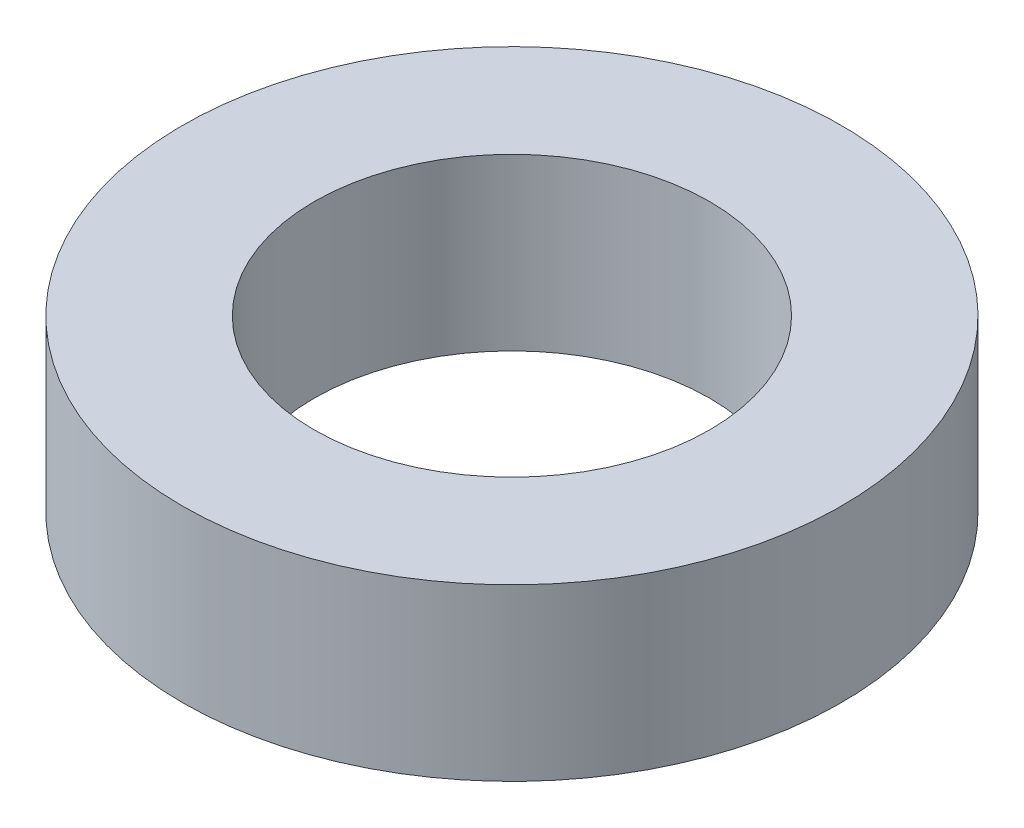
ISO-10303-21;
HEADER;
FILE_DESCRIPTION(('STEP AP214'),'2;1');
FILE_NAME('part.step','',(''),(''),'','','');
FILE_SCHEMA(('AUTOMOTIVE_DESIGN { 1 0 10303 214 1 1 1 1 }'));
ENDSEC;
DATA;
#1=APPLICATION_CONTEXT('core data for automotive mechanical design processes');
#2=APPLICATION_PROTOCOL_DEFINITION('international standard','automotive_design',2000,#1);
#3=PRODUCT_CONTEXT('',#1,'mechanical');
#4=PRODUCT('Part','Part','',(#3));
#5=PRODUCT_RELATED_PRODUCT_CATEGORY('part','',(#4));
#6=PRODUCT_DEFINITION_FORMATION('','',#4);
#7=PRODUCT_DEFINITION_CONTEXT('part definition',#1,'design');
#8=PRODUCT_DEFINITION('design','',#6,#7);
#9=PRODUCT_DEFINITION_SHAPE('','',#8);
#10=(LENGTH_UNIT() NAMED_UNIT(*) SI_UNIT(.MILLI.,.METRE.));
#11=(NAMED_UNIT(*) PLANE_ANGLE_UNIT() SI_UNIT($,.RADIAN.));
#12=(NAMED_UNIT(*) SI_UNIT($,.STERADIAN.) SOLID_ANGLE_UNIT());
#13=UNCERTAINTY_MEASURE_WITH_UNIT(LENGTH_MEASURE(1.E-05),#10,'distance_accuracy_value','');
#14=(GEOMETRIC_REPRESENTATION_CONTEXT(3) GLOBAL_UNCERTAINTY_ASSIGNED_CONTEXT((#13)) GLOBAL_UNIT_ASSIGNED_CONTEXT((#10,
#11,#12)) REPRESENTATION_CONTEXT('',''));
#15=CARTESIAN_POINT('',(0.,0.,0.));
#16=DIRECTION('',(0.,0.,1.));
#17=DIRECTION('',(1.,0.,0.));
#18=AXIS2_PLACEMENT_3D('',#15,#16,#17);
#19=CARTESIAN_POINT('',(0.,7.75,0.));
#20=DIRECTION('',(0.,1.,0.));
#21=DIRECTION('',(0.,0.,1.));
#22=AXIS2_PLACEMENT_3D('',#19,#20,#21);
#23=PLANE('',#22);
#24=CARTESIAN_POINT('',(0.,7.75,0.));
#25=DIRECTION('',(0.,1.,0.));
#26=DIRECTION('',(0.,0.,1.));
#27=AXIS2_PLACEMENT_3D('',#24,#25,#26);
#28=CIRCLE('',#27,15.);
#29=CARTESIAN_POINT('',(0.,7.75,15.));
#30=VERTEX_POINT('',#29);
#31=EDGE_CURVE('E10',#30,#30,#28,.T.);
#32=ORIENTED_EDGE('',*,*,#31,.T.);
#33=EDGE_LOOP('',(#32));
#34=FACE_BOUND('',#33,.T.);
#35=CARTESIAN_POINT('',(0.,7.75,0.));
#36=DIRECTION('',(0.,1.,0.));
#37=DIRECTION('',(0.,0.,1.));
#38=AXIS2_PLACEMENT_3D('',#35,#36,#37);
#39=CIRCLE('',#38,9.);
#40=CARTESIAN_POINT('',(0.,7.75,9.));
#41=VERTEX_POINT('',#40);
#42=EDGE_CURVE('E56',#41,#41,#39,.T.);
#43=ORIENTED_EDGE('',*,*,#42,.F.);
#44=EDGE_LOOP('',(#43));
#45=FACE_BOUND('',#44,.T.);
#46=ADVANCED_FACE('F43',(#34,#45),#23,.T.);
#47=CARTESIAN_POINT('',(0.,0.,0.));
#48=DIRECTION('',(0.,1.,0.));
#49=DIRECTION('',(0.,0.,1.));
#50=AXIS2_PLACEMENT_3D('',#47,#48,#49);
#51=PLANE('',#50);
#52=CARTESIAN_POINT('',(0.,0.,0.));
#53=DIRECTION('',(0.,1.,0.));
#54=DIRECTION('',(0.,0.,1.));
#55=AXIS2_PLACEMENT_3D('',#52,#53,#54);
#56=CIRCLE('',#55,15.);
#57=CARTESIAN_POINT('',(0.,0.,15.));
#58=VERTEX_POINT('',#57);
#59=EDGE_CURVE('E47',#58,#58,#56,.T.);
#60=ORIENTED_EDGE('',*,*,#59,.F.);
#61=EDGE_LOOP('',(#60));
#62=FACE_BOUND('',#61,.T.);
#63=CARTESIAN_POINT('',(0.,0.,0.));
#64=DIRECTION('',(0.,1.,0.));
#65=DIRECTION('',(0.,0.,1.));
#66=AXIS2_PLACEMENT_3D('',#63,#64,#65);
#67=CIRCLE('',#66,9.);
#68=CARTESIAN_POINT('',(0.,0.,9.));
#69=VERTEX_POINT('',#68);
#70=EDGE_CURVE('E58',#69,#69,#67,.T.);
#71=ORIENTED_EDGE('',*,*,#70,.T.);
#72=EDGE_LOOP('',(#71));
#73=FACE_BOUND('',#72,.T.);
#74=ADVANCED_FACE('F70',(#62,#73),#51,.F.);
#75=CARTESIAN_POINT('',(0.,7.75,0.));
#76=DIRECTION('',(0.,-1.,0.));
#77=DIRECTION('',(0.,0.,-1.));
#78=AXIS2_PLACEMENT_3D('',#75,#76,#77);
#79=CYLINDRICAL_SURFACE('',#78,15.);
#80=ORIENTED_EDGE('',*,*,#31,.F.);
#81=EDGE_LOOP('',(#80));
#82=FACE_BOUND('',#81,.T.);
#83=ORIENTED_EDGE('',*,*,#59,.T.);
#84=EDGE_LOOP('',(#83));
#85=FACE_BOUND('',#84,.T.);
#86=ADVANCED_FACE('F45',(#82,#85),#79,.T.);
#87=CARTESIAN_POINT('',(0.,7.75,0.));
#88=DIRECTION('',(0.,-1.,0.));
#89=DIRECTION('',(0.,0.,-1.));
#90=AXIS2_PLACEMENT_3D('',#87,#88,#89);
#91=CYLINDRICAL_SURFACE('',#90,9.);
#92=ORIENTED_EDGE('',*,*,#42,.T.);
#93=EDGE_LOOP('',(#92));
#94=FACE_BOUND('',#93,.T.);
#95=ORIENTED_EDGE('',*,*,#70,.F.);
#96=EDGE_LOOP('',(#95));
#97=FACE_BOUND('',#96,.T.);
#98=ADVANCED_FACE('F66',(#94,#97),#91,.F.);
#99=CLOSED_SHELL('',(#46,#74,#86,#98));
#100=MANIFOLD_SOLID_BREP('B2',#99);
#101=ADVANCED_BREP_SHAPE_REPRESENTATION('',(#18,#100),#14);
#102=SHAPE_DEFINITION_REPRESENTATION(#9,#101);
ENDSEC;
END-ISO-10303-21;
